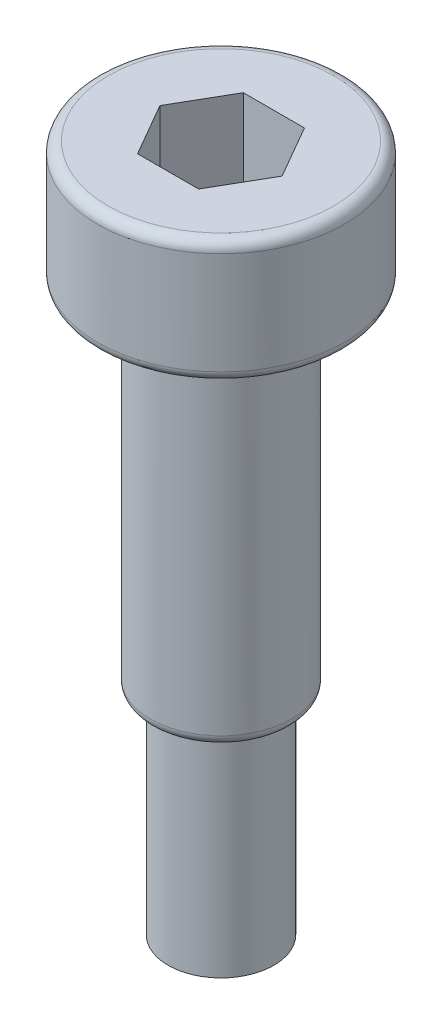
ISO-10303-21;
HEADER;
FILE_DESCRIPTION(('STEP AP214'),'2;1');
FILE_NAME('part.step','',(''),(''),'','','');
FILE_SCHEMA(('AUTOMOTIVE_DESIGN { 1 0 10303 214 1 1 1 1 }'));
ENDSEC;
DATA;
#1=APPLICATION_CONTEXT('core data for automotive mechanical design processes');
#2=APPLICATION_PROTOCOL_DEFINITION('international standard','automotive_design',2000,#1);
#3=PRODUCT_CONTEXT('',#1,'mechanical');
#4=PRODUCT('Part','Part','',(#3));
#5=PRODUCT_RELATED_PRODUCT_CATEGORY('part','',(#4));
#6=PRODUCT_DEFINITION_FORMATION('','',#4);
#7=PRODUCT_DEFINITION_CONTEXT('part definition',#1,'design');
#8=PRODUCT_DEFINITION('design','',#6,#7);
#9=PRODUCT_DEFINITION_SHAPE('','',#8);
#10=(LENGTH_UNIT() NAMED_UNIT(*) SI_UNIT(.MILLI.,.METRE.));
#11=(NAMED_UNIT(*) PLANE_ANGLE_UNIT() SI_UNIT($,.RADIAN.));
#12=(NAMED_UNIT(*) SI_UNIT($,.STERADIAN.) SOLID_ANGLE_UNIT());
#13=UNCERTAINTY_MEASURE_WITH_UNIT(LENGTH_MEASURE(1.E-05),#10,'distance_accuracy_value','');
#14=(GEOMETRIC_REPRESENTATION_CONTEXT(3) GLOBAL_UNCERTAINTY_ASSIGNED_CONTEXT((#13)) GLOBAL_UNIT_ASSIGNED_CONTEXT((#10,
#11,#12)) REPRESENTATION_CONTEXT('',''));
#15=CARTESIAN_POINT('',(0.,0.,0.));
#16=DIRECTION('',(0.,0.,1.));
#17=DIRECTION('',(1.,0.,0.));
#18=AXIS2_PLACEMENT_3D('',#15,#16,#17);
#19=CARTESIAN_POINT('',(0.,0.,0.));
#20=DIRECTION('',(0.,-1.,0.));
#21=DIRECTION('',(1.,0.,0.));
#22=AXIS2_PLACEMENT_3D('',#19,#20,#21);
#23=PLANE('',#22);
#24=CARTESIAN_POINT('',(0.,0.,0.));
#25=DIRECTION('',(0.,1.,0.));
#26=DIRECTION('',(-1.,0.,0.));
#27=AXIS2_PLACEMENT_3D('',#24,#25,#26);
#28=CIRCLE('',#27,1.5);
#29=CARTESIAN_POINT('',(-1.5,0.,0.));
#30=VERTEX_POINT('',#29);
#31=EDGE_CURVE('E154',#30,#30,#28,.T.);
#32=ORIENTED_EDGE('',*,*,#31,.F.);
#33=EDGE_LOOP('',(#32));
#34=FACE_BOUND('',#33,.T.);
#35=ADVANCED_FACE('F41',(#34),#23,.T.);
#36=CARTESIAN_POINT('',(0.,19.5,0.));
#37=DIRECTION('',(0.,1.,0.));
#38=DIRECTION('',(-1.,0.,0.));
#39=AXIS2_PLACEMENT_3D('',#36,#37,#38);
#40=CYLINDRICAL_SURFACE('',#39,1.5);
#41=ORIENTED_EDGE('',*,*,#31,.T.);
#42=EDGE_LOOP('',(#41));
#43=FACE_BOUND('',#42,.T.);
#44=CARTESIAN_POINT('',(0.,6.,0.));
#45=DIRECTION('',(0.,1.,0.));
#46=DIRECTION('',(-1.,0.,0.));
#47=AXIS2_PLACEMENT_3D('',#44,#45,#46);
#48=CIRCLE('',#47,1.5);
#49=CARTESIAN_POINT('',(-1.5,6.,0.));
#50=VERTEX_POINT('',#49);
#51=EDGE_CURVE('E151',#50,#50,#48,.T.);
#52=ORIENTED_EDGE('',*,*,#51,.F.);
#53=EDGE_LOOP('',(#52));
#54=FACE_BOUND('',#53,.T.);
#55=ADVANCED_FACE('F198',(#43,#54),#40,.T.);
#56=CARTESIAN_POINT('',(-1.5,6.,0.));
#57=DIRECTION('',(0.,-1.,0.));
#58=DIRECTION('',(1.,0.,0.));
#59=AXIS2_PLACEMENT_3D('',#56,#57,#58);
#60=PLANE('',#59);
#61=CARTESIAN_POINT('',(0.,6.,0.));
#62=DIRECTION('',(0.,-1.,0.));
#63=DIRECTION('',(1.,0.,0.));
#64=AXIS2_PLACEMENT_3D('',#61,#62,#63);
#65=CIRCLE('',#64,1.7);
#66=CARTESIAN_POINT('',(1.7,6.,0.));
#67=VERTEX_POINT('',#66);
#68=EDGE_CURVE('E49',#67,#67,#65,.T.);
#69=ORIENTED_EDGE('',*,*,#68,.T.);
#70=EDGE_LOOP('',(#69));
#71=FACE_BOUND('',#70,.T.);
#72=ORIENTED_EDGE('',*,*,#51,.T.);
#73=EDGE_LOOP('',(#72));
#74=FACE_BOUND('',#73,.T.);
#75=ADVANCED_FACE('F171',(#71,#74),#60,.T.);
#76=CARTESIAN_POINT('',(0.,19.5,0.));
#77=DIRECTION('',(0.,1.,0.));
#78=DIRECTION('',(-1.,0.,0.));
#79=AXIS2_PLACEMENT_3D('',#76,#77,#78);
#80=CYLINDRICAL_SURFACE('',#79,2.);
#81=CARTESIAN_POINT('',(0.,6.3,0.));
#82=DIRECTION('',(0.,-1.,0.));
#83=DIRECTION('',(1.,0.,0.));
#84=AXIS2_PLACEMENT_3D('',#81,#82,#83);
#85=CIRCLE('',#84,2.);
#86=CARTESIAN_POINT('',(2.,6.3,0.));
#87=VERTEX_POINT('',#86);
#88=EDGE_CURVE('E166',#87,#87,#85,.F.);
#89=ORIENTED_EDGE('',*,*,#88,.T.);
#90=EDGE_LOOP('',(#89));
#91=FACE_BOUND('',#90,.T.);
#92=CARTESIAN_POINT('',(0.,16.,0.));
#93=DIRECTION('',(0.,1.,0.));
#94=DIRECTION('',(-1.,0.,0.));
#95=AXIS2_PLACEMENT_3D('',#92,#93,#94);
#96=CIRCLE('',#95,2.);
#97=CARTESIAN_POINT('',(-2.,16.,0.));
#98=VERTEX_POINT('',#97);
#99=EDGE_CURVE('E143',#98,#98,#96,.T.);
#100=ORIENTED_EDGE('',*,*,#99,.F.);
#101=EDGE_LOOP('',(#100));
#102=FACE_BOUND('',#101,.T.);
#103=ADVANCED_FACE('F180',(#91,#102),#80,.T.);
#104=CARTESIAN_POINT('',(-2.,16.,0.));
#105=DIRECTION('',(0.,-1.,0.));
#106=DIRECTION('',(1.,0.,0.));
#107=AXIS2_PLACEMENT_3D('',#104,#105,#106);
#108=PLANE('',#107);
#109=CARTESIAN_POINT('',(0.,16.,0.));
#110=DIRECTION('',(0.,-1.,0.));
#111=DIRECTION('',(1.,0.,0.));
#112=AXIS2_PLACEMENT_3D('',#109,#110,#111);
#113=CIRCLE('',#112,3.2);
#114=CARTESIAN_POINT('',(3.2,16.,0.));
#115=VERTEX_POINT('',#114);
#116=EDGE_CURVE('E11',#115,#115,#113,.T.);
#117=ORIENTED_EDGE('',*,*,#116,.T.);
#118=EDGE_LOOP('',(#117));
#119=FACE_BOUND('',#118,.T.);
#120=ORIENTED_EDGE('',*,*,#99,.T.);
#121=EDGE_LOOP('',(#120));
#122=FACE_BOUND('',#121,.T.);
#123=ADVANCED_FACE('F183',(#119,#122),#108,.T.);
#124=CARTESIAN_POINT('',(0.,19.5,0.));
#125=DIRECTION('',(0.,1.,0.));
#126=DIRECTION('',(-1.,0.,0.));
#127=AXIS2_PLACEMENT_3D('',#124,#125,#126);
#128=CYLINDRICAL_SURFACE('',#127,3.5);
#129=CARTESIAN_POINT('',(0.,19.2,0.));
#130=DIRECTION('',(0.,1.,0.));
#131=DIRECTION('',(-1.,0.,0.));
#132=AXIS2_PLACEMENT_3D('',#129,#130,#131);
#133=CIRCLE('',#132,3.5);
#134=CARTESIAN_POINT('',(-3.5,19.2,0.));
#135=VERTEX_POINT('',#134);
#136=EDGE_CURVE('E163',#135,#135,#133,.F.);
#137=ORIENTED_EDGE('',*,*,#136,.T.);
#138=EDGE_LOOP('',(#137));
#139=FACE_BOUND('',#138,.T.);
#140=CARTESIAN_POINT('',(0.,16.3,0.));
#141=DIRECTION('',(0.,-1.,0.));
#142=DIRECTION('',(1.,0.,0.));
#143=AXIS2_PLACEMENT_3D('',#140,#141,#142);
#144=CIRCLE('',#143,3.5);
#145=CARTESIAN_POINT('',(3.5,16.3,0.));
#146=VERTEX_POINT('',#145);
#147=EDGE_CURVE('E160',#146,#146,#144,.F.);
#148=ORIENTED_EDGE('',*,*,#147,.T.);
#149=EDGE_LOOP('',(#148));
#150=FACE_BOUND('',#149,.T.);
#151=ADVANCED_FACE('F188',(#139,#150),#128,.T.);
#152=CARTESIAN_POINT('',(-3.5,19.5,0.));
#153=DIRECTION('',(0.,1.,0.));
#154=DIRECTION('',(-1.,0.,0.));
#155=AXIS2_PLACEMENT_3D('',#152,#153,#154);
#156=PLANE('',#155);
#157=DIRECTION('',(1.,0.,0.));
#158=VECTOR('',#157,1.);
#159=CARTESIAN_POINT('',(-0.866025403784439,19.5,1.5));
#160=LINE('',#159,#158);
#161=CARTESIAN_POINT('',(-0.866025403784439,19.5,1.5));
#162=VERTEX_POINT('',#161);
#163=CARTESIAN_POINT('',(0.866025403784438,19.5,1.5));
#164=VERTEX_POINT('',#163);
#165=EDGE_CURVE('E56',#162,#164,#160,.T.);
#166=ORIENTED_EDGE('',*,*,#165,.F.);
#167=DIRECTION('',(0.5,0.,0.866025403784438));
#168=VECTOR('',#167,1.);
#169=CARTESIAN_POINT('',(-1.73205080756888,19.5,0.));
#170=LINE('',#169,#168);
#171=CARTESIAN_POINT('',(-1.73205080756888,19.5,0.));
#172=VERTEX_POINT('',#171);
#173=EDGE_CURVE('E139',#172,#162,#170,.T.);
#174=ORIENTED_EDGE('',*,*,#173,.F.);
#175=DIRECTION('',(-0.5,0.,0.866025403784439));
#176=VECTOR('',#175,1.);
#177=CARTESIAN_POINT('',(-0.86602540378444,19.5,-1.5));
#178=LINE('',#177,#176);
#179=CARTESIAN_POINT('',(-0.86602540378444,19.5,-1.5));
#180=VERTEX_POINT('',#179);
#181=EDGE_CURVE('E137',#180,#172,#178,.T.);
#182=ORIENTED_EDGE('',*,*,#181,.F.);
#183=DIRECTION('',(-1.,0.,0.));
#184=VECTOR('',#183,1.);
#185=CARTESIAN_POINT('',(0.866025403784437,19.5,-1.5));
#186=LINE('',#185,#184);
#187=CARTESIAN_POINT('',(0.866025403784437,19.5,-1.5));
#188=VERTEX_POINT('',#187);
#189=EDGE_CURVE('E104',#188,#180,#186,.T.);
#190=ORIENTED_EDGE('',*,*,#189,.F.);
#191=DIRECTION('',(-0.5,0.,-0.866025403784438));
#192=VECTOR('',#191,1.);
#193=CARTESIAN_POINT('',(1.73205080756888,19.5,0.));
#194=LINE('',#193,#192);
#195=CARTESIAN_POINT('',(1.73205080756888,19.5,0.));
#196=VERTEX_POINT('',#195);
#197=EDGE_CURVE('E133',#196,#188,#194,.T.);
#198=ORIENTED_EDGE('',*,*,#197,.F.);
#199=DIRECTION('',(0.5,0.,-0.866025403784439));
#200=VECTOR('',#199,1.);
#201=CARTESIAN_POINT('',(0.866025403784437,19.5,1.5));
#202=LINE('',#201,#200);
#203=EDGE_CURVE('E130',#164,#196,#202,.T.);
#204=ORIENTED_EDGE('',*,*,#203,.F.);
#205=EDGE_LOOP('',(#166,#174,#182,#190,#198,#204));
#206=FACE_BOUND('',#205,.T.);
#207=CARTESIAN_POINT('',(0.,19.5,0.));
#208=DIRECTION('',(0.,1.,0.));
#209=DIRECTION('',(-1.,0.,0.));
#210=AXIS2_PLACEMENT_3D('',#207,#208,#209);
#211=CIRCLE('',#210,3.2);
#212=CARTESIAN_POINT('',(-3.2,19.5,0.));
#213=VERTEX_POINT('',#212);
#214=EDGE_CURVE('E157',#213,#213,#211,.T.);
#215=ORIENTED_EDGE('',*,*,#214,.T.);
#216=EDGE_LOOP('',(#215));
#217=FACE_BOUND('',#216,.T.);
#218=ADVANCED_FACE('F194',(#206,#217),#156,.T.);
#219=CARTESIAN_POINT('',(0.,19.2,0.));
#220=DIRECTION('',(0.,1.,0.));
#221=DIRECTION('',(-1.,0.,0.));
#222=AXIS2_PLACEMENT_3D('',#219,#220,#221);
#223=TOROIDAL_SURFACE('',#222,3.2,0.3);
#224=ORIENTED_EDGE('',*,*,#136,.F.);
#225=EDGE_LOOP('',(#224));
#226=FACE_BOUND('',#225,.T.);
#227=ORIENTED_EDGE('',*,*,#214,.F.);
#228=EDGE_LOOP('',(#227));
#229=FACE_BOUND('',#228,.T.);
#230=ADVANCED_FACE('F177',(#226,#229),#223,.T.);
#231=CARTESIAN_POINT('',(0.,6.3,0.));
#232=DIRECTION('',(0.,-1.,0.));
#233=DIRECTION('',(1.,0.,0.));
#234=AXIS2_PLACEMENT_3D('',#231,#232,#233);
#235=TOROIDAL_SURFACE('',#234,1.7,0.3);
#236=ORIENTED_EDGE('',*,*,#68,.F.);
#237=EDGE_LOOP('',(#236));
#238=FACE_BOUND('',#237,.T.);
#239=ORIENTED_EDGE('',*,*,#88,.F.);
#240=EDGE_LOOP('',(#239));
#241=FACE_BOUND('',#240,.T.);
#242=ADVANCED_FACE('F174',(#238,#241),#235,.T.);
#243=CARTESIAN_POINT('',(0.,16.3,0.));
#244=DIRECTION('',(0.,-1.,0.));
#245=DIRECTION('',(1.,0.,0.));
#246=AXIS2_PLACEMENT_3D('',#243,#244,#245);
#247=TOROIDAL_SURFACE('',#246,3.2,0.3);
#248=ORIENTED_EDGE('',*,*,#116,.F.);
#249=EDGE_LOOP('',(#248));
#250=FACE_BOUND('',#249,.T.);
#251=ORIENTED_EDGE('',*,*,#147,.F.);
#252=EDGE_LOOP('',(#251));
#253=FACE_BOUND('',#252,.T.);
#254=ADVANCED_FACE('F43',(#250,#253),#247,.T.);
#255=CARTESIAN_POINT('',(-0.866025403784439,17.1,1.5));
#256=DIRECTION('',(0.,0.,1.));
#257=DIRECTION('',(1.,0.,0.));
#258=AXIS2_PLACEMENT_3D('',#255,#256,#257);
#259=PLANE('',#258);
#260=ORIENTED_EDGE('',*,*,#165,.T.);
#261=DIRECTION('',(0.,1.,0.));
#262=VECTOR('',#261,1.);
#263=CARTESIAN_POINT('',(0.866025403784437,17.1,1.5));
#264=LINE('',#263,#262);
#265=CARTESIAN_POINT('',(0.866025403784437,17.1,1.5));
#266=VERTEX_POINT('',#265);
#267=EDGE_CURVE('E86',#266,#164,#264,.T.);
#268=ORIENTED_EDGE('',*,*,#267,.F.);
#269=DIRECTION('',(1.,0.,0.));
#270=VECTOR('',#269,1.);
#271=CARTESIAN_POINT('',(-0.866025403784439,17.1,1.5));
#272=LINE('',#271,#270);
#273=CARTESIAN_POINT('',(-0.866025403784439,17.1,1.5));
#274=VERTEX_POINT('',#273);
#275=EDGE_CURVE('E141',#274,#266,#272,.T.);
#276=ORIENTED_EDGE('',*,*,#275,.F.);
#277=DIRECTION('',(0.,1.,0.));
#278=VECTOR('',#277,1.);
#279=CARTESIAN_POINT('',(-0.866025403784439,17.1,1.5));
#280=LINE('',#279,#278);
#281=EDGE_CURVE('E64',#274,#162,#280,.T.);
#282=ORIENTED_EDGE('',*,*,#281,.T.);
#283=EDGE_LOOP('',(#260,#268,#276,#282));
#284=FACE_BOUND('',#283,.T.);
#285=ADVANCED_FACE('F224',(#284),#259,.F.);
#286=CARTESIAN_POINT('',(-1.73205080756888,17.1,0.));
#287=DIRECTION('',(-0.866025403784438,0.,0.5));
#288=DIRECTION('',(0.5,0.,0.866025403784438));
#289=AXIS2_PLACEMENT_3D('',#286,#287,#288);
#290=PLANE('',#289);
#291=ORIENTED_EDGE('',*,*,#173,.T.);
#292=ORIENTED_EDGE('',*,*,#281,.F.);
#293=DIRECTION('',(0.5,0.,0.866025403784438));
#294=VECTOR('',#293,1.);
#295=CARTESIAN_POINT('',(-1.73205080756888,17.1,0.));
#296=LINE('',#295,#294);
#297=CARTESIAN_POINT('',(-1.73205080756888,17.1,0.));
#298=VERTEX_POINT('',#297);
#299=EDGE_CURVE('E116',#298,#274,#296,.T.);
#300=ORIENTED_EDGE('',*,*,#299,.F.);
#301=DIRECTION('',(0.,1.,0.));
#302=VECTOR('',#301,1.);
#303=CARTESIAN_POINT('',(-1.73205080756888,17.1,0.));
#304=LINE('',#303,#302);
#305=EDGE_CURVE('E108',#298,#172,#304,.T.);
#306=ORIENTED_EDGE('',*,*,#305,.T.);
#307=EDGE_LOOP('',(#291,#292,#300,#306));
#308=FACE_BOUND('',#307,.T.);
#309=ADVANCED_FACE('F229',(#308),#290,.F.);
#310=CARTESIAN_POINT('',(-0.86602540378444,17.1,-1.5));
#311=DIRECTION('',(-0.866025403784439,0.,-0.5));
#312=DIRECTION('',(-0.5,0.,0.866025403784439));
#313=AXIS2_PLACEMENT_3D('',#310,#311,#312);
#314=PLANE('',#313);
#315=ORIENTED_EDGE('',*,*,#181,.T.);
#316=ORIENTED_EDGE('',*,*,#305,.F.);
#317=DIRECTION('',(-0.5,0.,0.866025403784439));
#318=VECTOR('',#317,1.);
#319=CARTESIAN_POINT('',(-0.86602540378444,17.1,-1.5));
#320=LINE('',#319,#318);
#321=CARTESIAN_POINT('',(-0.86602540378444,17.1,-1.5));
#322=VERTEX_POINT('',#321);
#323=EDGE_CURVE('E112',#322,#298,#320,.T.);
#324=ORIENTED_EDGE('',*,*,#323,.F.);
#325=DIRECTION('',(0.,1.,0.));
#326=VECTOR('',#325,1.);
#327=CARTESIAN_POINT('',(-0.86602540378444,17.1,-1.5));
#328=LINE('',#327,#326);
#329=EDGE_CURVE('E97',#322,#180,#328,.T.);
#330=ORIENTED_EDGE('',*,*,#329,.T.);
#331=EDGE_LOOP('',(#315,#316,#324,#330));
#332=FACE_BOUND('',#331,.T.);
#333=ADVANCED_FACE('F113',(#332),#314,.F.);
#334=CARTESIAN_POINT('',(0.866025403784437,17.1,-1.5));
#335=DIRECTION('',(0.,0.,-1.));
#336=DIRECTION('',(-1.,0.,0.));
#337=AXIS2_PLACEMENT_3D('',#334,#335,#336);
#338=PLANE('',#337);
#339=ORIENTED_EDGE('',*,*,#189,.T.);
#340=ORIENTED_EDGE('',*,*,#329,.F.);
#341=DIRECTION('',(-1.,0.,0.));
#342=VECTOR('',#341,1.);
#343=CARTESIAN_POINT('',(0.866025403784437,17.1,-1.5));
#344=LINE('',#343,#342);
#345=CARTESIAN_POINT('',(0.866025403784437,17.1,-1.5));
#346=VERTEX_POINT('',#345);
#347=EDGE_CURVE('E101',#346,#322,#344,.T.);
#348=ORIENTED_EDGE('',*,*,#347,.F.);
#349=DIRECTION('',(0.,1.,0.));
#350=VECTOR('',#349,1.);
#351=CARTESIAN_POINT('',(0.866025403784437,17.1,-1.5));
#352=LINE('',#351,#350);
#353=EDGE_CURVE('E109',#346,#188,#352,.T.);
#354=ORIENTED_EDGE('',*,*,#353,.T.);
#355=EDGE_LOOP('',(#339,#340,#348,#354));
#356=FACE_BOUND('',#355,.T.);
#357=ADVANCED_FACE('F99',(#356),#338,.F.);
#358=CARTESIAN_POINT('',(1.73205080756888,17.1,0.));
#359=DIRECTION('',(0.866025403784438,0.,-0.5));
#360=DIRECTION('',(-0.5,0.,-0.866025403784439));
#361=AXIS2_PLACEMENT_3D('',#358,#359,#360);
#362=PLANE('',#361);
#363=ORIENTED_EDGE('',*,*,#197,.T.);
#364=ORIENTED_EDGE('',*,*,#353,.F.);
#365=DIRECTION('',(-0.5,0.,-0.866025403784438));
#366=VECTOR('',#365,1.);
#367=CARTESIAN_POINT('',(1.73205080756888,17.1,0.));
#368=LINE('',#367,#366);
#369=CARTESIAN_POINT('',(1.73205080756888,17.1,0.));
#370=VERTEX_POINT('',#369);
#371=EDGE_CURVE('E122',#370,#346,#368,.T.);
#372=ORIENTED_EDGE('',*,*,#371,.F.);
#373=DIRECTION('',(0.,1.,0.));
#374=VECTOR('',#373,1.);
#375=CARTESIAN_POINT('',(1.73205080756888,17.1,0.));
#376=LINE('',#375,#374);
#377=EDGE_CURVE('E146',#370,#196,#376,.T.);
#378=ORIENTED_EDGE('',*,*,#377,.T.);
#379=EDGE_LOOP('',(#363,#364,#372,#378));
#380=FACE_BOUND('',#379,.T.);
#381=ADVANCED_FACE('F240',(#380),#362,.F.);
#382=CARTESIAN_POINT('',(0.866025403784437,17.1,1.5));
#383=DIRECTION('',(0.866025403784439,0.,0.5));
#384=DIRECTION('',(0.5,0.,-0.866025403784439));
#385=AXIS2_PLACEMENT_3D('',#382,#383,#384);
#386=PLANE('',#385);
#387=ORIENTED_EDGE('',*,*,#203,.T.);
#388=ORIENTED_EDGE('',*,*,#377,.F.);
#389=DIRECTION('',(0.5,0.,-0.866025403784439));
#390=VECTOR('',#389,1.);
#391=CARTESIAN_POINT('',(0.866025403784437,17.1,1.5));
#392=LINE('',#391,#390);
#393=EDGE_CURVE('E124',#266,#370,#392,.T.);
#394=ORIENTED_EDGE('',*,*,#393,.F.);
#395=ORIENTED_EDGE('',*,*,#267,.T.);
#396=EDGE_LOOP('',(#387,#388,#394,#395));
#397=FACE_BOUND('',#396,.T.);
#398=ADVANCED_FACE('F237',(#397),#386,.F.);
#399=CARTESIAN_POINT('',(0.,17.1,0.));
#400=DIRECTION('',(0.,1.,0.));
#401=DIRECTION('',(0.,0.,1.));
#402=AXIS2_PLACEMENT_3D('',#399,#400,#401);
#403=PLANE('',#402);
#404=ORIENTED_EDGE('',*,*,#275,.T.);
#405=ORIENTED_EDGE('',*,*,#393,.T.);
#406=ORIENTED_EDGE('',*,*,#371,.T.);
#407=ORIENTED_EDGE('',*,*,#347,.T.);
#408=ORIENTED_EDGE('',*,*,#323,.T.);
#409=ORIENTED_EDGE('',*,*,#299,.T.);
#410=EDGE_LOOP('',(#404,#405,#406,#407,#408,#409));
#411=FACE_BOUND('',#410,.T.);
#412=ADVANCED_FACE('F119',(#411),#403,.T.);
#413=CLOSED_SHELL('',(#35,#55,#75,#103,#123,#151,#218,#230,#242,#254,#285,#309,#333,#357,#381,
#398,#412));
#414=MANIFOLD_SOLID_BREP('B2',#413);
#415=ADVANCED_BREP_SHAPE_REPRESENTATION('',(#18,#414),#14);
#416=SHAPE_DEFINITION_REPRESENTATION(#9,#415);
ENDSEC;
END-ISO-10303-21;
